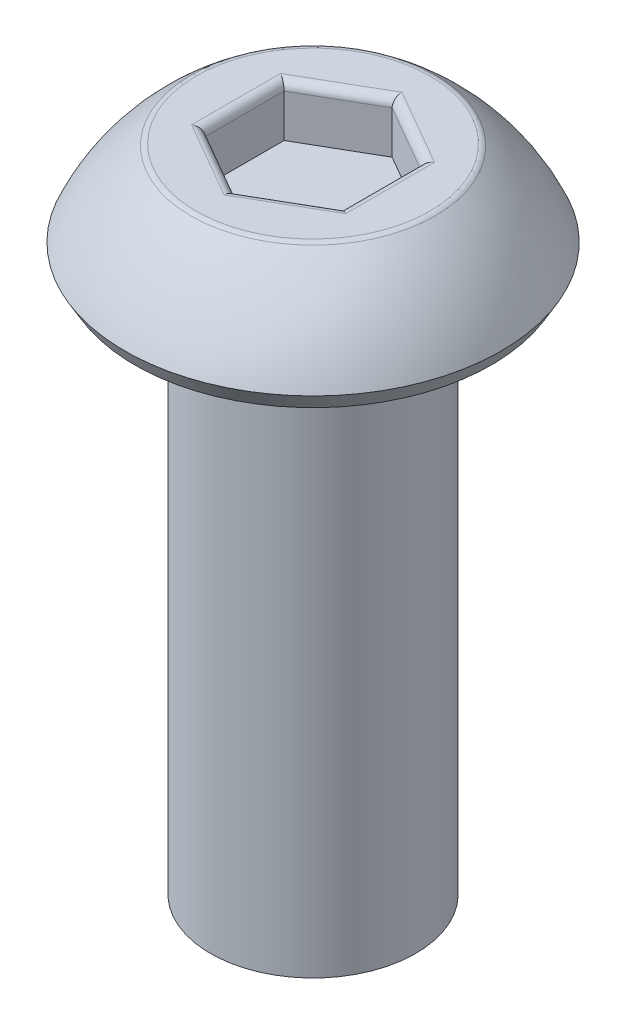
ISO-10303-21;
HEADER;
FILE_DESCRIPTION(('STEP AP214'),'2;1');
FILE_NAME('part.step','',(''),(''),'','','');
FILE_SCHEMA(('AUTOMOTIVE_DESIGN { 1 0 10303 214 1 1 1 1 }'));
ENDSEC;
DATA;
#1=APPLICATION_CONTEXT('core data for automotive mechanical design processes');
#2=APPLICATION_PROTOCOL_DEFINITION('international standard','automotive_design',2000,#1);
#3=PRODUCT_CONTEXT('',#1,'mechanical');
#4=PRODUCT('Part','Part','',(#3));
#5=PRODUCT_RELATED_PRODUCT_CATEGORY('part','',(#4));
#6=PRODUCT_DEFINITION_FORMATION('','',#4);
#7=PRODUCT_DEFINITION_CONTEXT('part definition',#1,'design');
#8=PRODUCT_DEFINITION('design','',#6,#7);
#9=PRODUCT_DEFINITION_SHAPE('','',#8);
#10=(LENGTH_UNIT() NAMED_UNIT(*) SI_UNIT(.MILLI.,.METRE.));
#11=(NAMED_UNIT(*) PLANE_ANGLE_UNIT() SI_UNIT($,.RADIAN.));
#12=(NAMED_UNIT(*) SI_UNIT($,.STERADIAN.) SOLID_ANGLE_UNIT());
#13=UNCERTAINTY_MEASURE_WITH_UNIT(LENGTH_MEASURE(1.E-05),#10,'distance_accuracy_value','');
#14=(GEOMETRIC_REPRESENTATION_CONTEXT(3) GLOBAL_UNCERTAINTY_ASSIGNED_CONTEXT((#13)) GLOBAL_UNIT_ASSIGNED_CONTEXT((#10,
#11,#12)) REPRESENTATION_CONTEXT('',''));
#15=CARTESIAN_POINT('',(0.,0.,0.));
#16=DIRECTION('',(0.,0.,1.));
#17=DIRECTION('',(1.,0.,0.));
#18=AXIS2_PLACEMENT_3D('',#15,#16,#17);
#19=CARTESIAN_POINT('',(0.,1.5,0.));
#20=DIRECTION('',(0.,-1.,0.));
#21=DIRECTION('',(0.,0.,-1.));
#22=AXIS2_PLACEMENT_3D('',#19,#20,#21);
#23=PLANE('',#22);
#24=CARTESIAN_POINT('',(0.,1.5,0.));
#25=DIRECTION('',(0.,-1.,0.));
#26=DIRECTION('',(0.,0.,-1.));
#27=AXIS2_PLACEMENT_3D('',#24,#25,#26);
#28=CIRCLE('',#27,1.70906948191647);
#29=CARTESIAN_POINT('',(0.,1.5,-1.70906948191647));
#30=VERTEX_POINT('',#29);
#31=EDGE_CURVE('E177',#30,#30,#28,.F.);
#32=ORIENTED_EDGE('',*,*,#31,.T.);
#33=EDGE_LOOP('',(#32));
#34=FACE_BOUND('',#33,.T.);
#35=DIRECTION('',(0.866025403784439,0.,-0.5));
#36=VECTOR('',#35,1.);
#37=CARTESIAN_POINT('',(0.5625,1.5,0.974278579257493));
#38=LINE('',#37,#36);
#39=CARTESIAN_POINT('',(1.125,1.5,0.649519052838329));
#40=VERTEX_POINT('',#39);
#41=CARTESIAN_POINT('',(0.,1.5,1.29903810567666));
#42=VERTEX_POINT('',#41);
#43=EDGE_CURVE('E172',#40,#42,#38,.F.);
#44=ORIENTED_EDGE('',*,*,#43,.T.);
#45=DIRECTION('',(0.866025403784439,0.,0.5));
#46=VECTOR('',#45,1.);
#47=CARTESIAN_POINT('',(-0.5625,1.5,0.974278579257493));
#48=LINE('',#47,#46);
#49=CARTESIAN_POINT('',(-1.125,1.5,0.649519052838329));
#50=VERTEX_POINT('',#49);
#51=EDGE_CURVE('E174',#42,#50,#48,.F.);
#52=ORIENTED_EDGE('',*,*,#51,.T.);
#53=DIRECTION('',(0.,0.,1.));
#54=VECTOR('',#53,1.);
#55=CARTESIAN_POINT('',(-1.125,1.5,0.));
#56=LINE('',#55,#54);
#57=CARTESIAN_POINT('',(-1.125,1.5,-0.649519052838329));
#58=VERTEX_POINT('',#57);
#59=EDGE_CURVE('E164',#50,#58,#56,.F.);
#60=ORIENTED_EDGE('',*,*,#59,.T.);
#61=DIRECTION('',(-0.866025403784439,0.,0.5));
#62=VECTOR('',#61,1.);
#63=CARTESIAN_POINT('',(-0.5625,1.5,-0.974278579257493));
#64=LINE('',#63,#62);
#65=CARTESIAN_POINT('',(0.,1.5,-1.29903810567666));
#66=VERTEX_POINT('',#65);
#67=EDGE_CURVE('E166',#58,#66,#64,.F.);
#68=ORIENTED_EDGE('',*,*,#67,.T.);
#69=DIRECTION('',(-0.866025403784439,0.,-0.5));
#70=VECTOR('',#69,1.);
#71=CARTESIAN_POINT('',(0.5625,1.5,-0.974278579257494));
#72=LINE('',#71,#70);
#73=CARTESIAN_POINT('',(1.125,1.5,-0.64951905283833));
#74=VERTEX_POINT('',#73);
#75=EDGE_CURVE('E168',#66,#74,#72,.F.);
#76=ORIENTED_EDGE('',*,*,#75,.T.);
#77=DIRECTION('',(0.,0.,-1.));
#78=VECTOR('',#77,1.);
#79=CARTESIAN_POINT('',(1.125,1.5,0.));
#80=LINE('',#79,#78);
#81=EDGE_CURVE('E170',#74,#40,#80,.F.);
#82=ORIENTED_EDGE('',*,*,#81,.T.);
#83=EDGE_LOOP('',(#44,#52,#60,#68,#76,#82));
#84=FACE_BOUND('',#83,.T.);
#85=ADVANCED_FACE('F35',(#34,#84),#23,.F.);
#86=CARTESIAN_POINT('',(0.,-0.931154789034212,0.));
#87=DIRECTION('',(0.,-1.,0.));
#88=DIRECTION('',(0.,0.,-1.));
#89=AXIS2_PLACEMENT_3D('',#86,#87,#88);
#90=DEGENERATE_TOROIDAL_SURFACE('',#89,0.00769348629276519,3.,.F.);
#91=CARTESIAN_POINT('',(0.,1.47526759952323,0.));
#92=DIRECTION('',(0.,-1.,0.));
#93=DIRECTION('',(0.,0.,-1.));
#94=AXIS2_PLACEMENT_3D('',#91,#92,#93);
#95=CIRCLE('',#94,1.78371135009948);
#96=CARTESIAN_POINT('',(0.,1.47526759952323,-1.78371135009948));
#97=VERTEX_POINT('',#96);
#98=EDGE_CURVE('E161',#97,#97,#95,.T.);
#99=ORIENTED_EDGE('',*,*,#98,.T.);
#100=EDGE_LOOP('',(#99));
#101=FACE_BOUND('',#100,.T.);
#102=CARTESIAN_POINT('',(0.,0.25,0.));
#103=DIRECTION('',(0.,-1.,0.));
#104=DIRECTION('',(0.,0.,-1.));
#105=AXIS2_PLACEMENT_3D('',#102,#103,#104);
#106=CIRCLE('',#105,2.75);
#107=CARTESIAN_POINT('',(0.,0.25,-2.75));
#108=VERTEX_POINT('',#107);
#109=EDGE_CURVE('E158',#108,#108,#106,.T.);
#110=ORIENTED_EDGE('',*,*,#109,.F.);
#111=EDGE_LOOP('',(#110));
#112=FACE_BOUND('',#111,.T.);
#113=ADVANCED_FACE('F244',(#101,#112),#90,.F.);
#114=CARTESIAN_POINT('',(0.,0.25,0.));
#115=DIRECTION('',(0.,1.,0.));
#116=DIRECTION('',(0.,0.,1.));
#117=AXIS2_PLACEMENT_3D('',#114,#115,#116);
#118=CONICAL_SURFACE('',#117,2.75,0.523598775598296);
#119=CARTESIAN_POINT('',(0.,0.,0.));
#120=DIRECTION('',(0.,-1.,0.));
#121=DIRECTION('',(0.,0.,-1.));
#122=AXIS2_PLACEMENT_3D('',#119,#120,#121);
#123=CIRCLE('',#122,2.60566243270259);
#124=CARTESIAN_POINT('',(0.,0.,-2.60566243270259));
#125=VERTEX_POINT('',#124);
#126=EDGE_CURVE('E155',#125,#125,#123,.T.);
#127=ORIENTED_EDGE('',*,*,#126,.F.);
#128=EDGE_LOOP('',(#127));
#129=FACE_BOUND('',#128,.T.);
#130=ORIENTED_EDGE('',*,*,#109,.T.);
#131=EDGE_LOOP('',(#130));
#132=FACE_BOUND('',#131,.T.);
#133=ADVANCED_FACE('F250',(#129,#132),#118,.T.);
#134=CARTESIAN_POINT('',(0.,0.,2.60566243270259));
#135=DIRECTION('',(0.,1.,0.));
#136=DIRECTION('',(0.,0.,1.));
#137=AXIS2_PLACEMENT_3D('',#134,#135,#136);
#138=PLANE('',#137);
#139=CARTESIAN_POINT('',(0.,0.,0.));
#140=DIRECTION('',(0.,-1.,0.));
#141=DIRECTION('',(0.,0.,-1.));
#142=AXIS2_PLACEMENT_3D('',#139,#140,#141);
#143=CIRCLE('',#142,1.5);
#144=CARTESIAN_POINT('',(0.,0.,-1.5));
#145=VERTEX_POINT('',#144);
#146=EDGE_CURVE('E152',#145,#145,#143,.T.);
#147=ORIENTED_EDGE('',*,*,#146,.F.);
#148=EDGE_LOOP('',(#147));
#149=FACE_BOUND('',#148,.T.);
#150=ORIENTED_EDGE('',*,*,#126,.T.);
#151=EDGE_LOOP('',(#150));
#152=FACE_BOUND('',#151,.T.);
#153=ADVANCED_FACE('F269',(#149,#152),#138,.F.);
#154=CARTESIAN_POINT('',(0.,-8.,0.));
#155=DIRECTION('',(0.,-1.,0.));
#156=DIRECTION('',(0.,0.,-1.));
#157=AXIS2_PLACEMENT_3D('',#154,#155,#156);
#158=CYLINDRICAL_SURFACE('',#157,1.5);
#159=CARTESIAN_POINT('',(0.,-8.,0.));
#160=DIRECTION('',(0.,-1.,0.));
#161=DIRECTION('',(0.,0.,-1.));
#162=AXIS2_PLACEMENT_3D('',#159,#160,#161);
#163=CIRCLE('',#162,1.5);
#164=CARTESIAN_POINT('',(0.,-8.,-1.5));
#165=VERTEX_POINT('',#164);
#166=EDGE_CURVE('E139',#165,#165,#163,.T.);
#167=ORIENTED_EDGE('',*,*,#166,.F.);
#168=EDGE_LOOP('',(#167));
#169=FACE_BOUND('',#168,.T.);
#170=ORIENTED_EDGE('',*,*,#146,.T.);
#171=EDGE_LOOP('',(#170));
#172=FACE_BOUND('',#171,.T.);
#173=ADVANCED_FACE('F274',(#169,#172),#158,.T.);
#174=CARTESIAN_POINT('',(0.,-8.,1.5));
#175=DIRECTION('',(0.,1.,0.));
#176=DIRECTION('',(0.,0.,1.));
#177=AXIS2_PLACEMENT_3D('',#174,#175,#176);
#178=PLANE('',#177);
#179=ORIENTED_EDGE('',*,*,#166,.T.);
#180=EDGE_LOOP('',(#179));
#181=FACE_BOUND('',#180,.T.);
#182=ADVANCED_FACE('F281',(#181),#178,.F.);
#183=CARTESIAN_POINT('',(0.999999999999999,0.75,-0.577350269189626));
#184=DIRECTION('',(0.5,0.,-0.866025403784439));
#185=DIRECTION('',(-0.866025403784439,0.,-0.5));
#186=AXIS2_PLACEMENT_3D('',#183,#184,#185);
#187=PLANE('',#186);
#188=DIRECTION('',(0.,1.,0.));
#189=VECTOR('',#188,1.);
#190=CARTESIAN_POINT('',(0.999999999999999,0.75,-0.577350269189626));
#191=LINE('',#190,#189);
#192=CARTESIAN_POINT('',(0.999999999999999,0.75,-0.577350269189626));
#193=VERTEX_POINT('',#192);
#194=CARTESIAN_POINT('',(0.999999999999999,1.375,-0.577350269189626));
#195=VERTEX_POINT('',#194);
#196=EDGE_CURVE('E137',#193,#195,#191,.T.);
#197=ORIENTED_EDGE('',*,*,#196,.T.);
#198=DIRECTION('',(-0.866025403784439,0.,-0.5));
#199=VECTOR('',#198,1.);
#200=CARTESIAN_POINT('',(0.999999999999999,1.375,-0.577350269189626));
#201=LINE('',#200,#199);
#202=CARTESIAN_POINT('',(0.,1.375,-1.15470053837925));
#203=VERTEX_POINT('',#202);
#204=EDGE_CURVE('E59',#195,#203,#201,.T.);
#205=ORIENTED_EDGE('',*,*,#204,.T.);
#206=DIRECTION('',(0.,1.,0.));
#207=VECTOR('',#206,1.);
#208=CARTESIAN_POINT('',(0.,0.75,-1.15470053837925));
#209=LINE('',#208,#207);
#210=CARTESIAN_POINT('',(0.,0.75,-1.15470053837925));
#211=VERTEX_POINT('',#210);
#212=EDGE_CURVE('E105',#211,#203,#209,.T.);
#213=ORIENTED_EDGE('',*,*,#212,.F.);
#214=DIRECTION('',(-0.866025403784439,0.,-0.5));
#215=VECTOR('',#214,1.);
#216=CARTESIAN_POINT('',(0.999999999999999,0.75,-0.577350269189626));
#217=LINE('',#216,#215);
#218=EDGE_CURVE('E109',#193,#211,#217,.T.);
#219=ORIENTED_EDGE('',*,*,#218,.F.);
#220=EDGE_LOOP('',(#197,#205,#213,#219));
#221=FACE_BOUND('',#220,.T.);
#222=ADVANCED_FACE('F107',(#221),#187,.F.);
#223=CARTESIAN_POINT('',(1.,0.75,0.577350269189626));
#224=DIRECTION('',(1.,0.,0.));
#225=DIRECTION('',(0.,0.,-1.));
#226=AXIS2_PLACEMENT_3D('',#223,#224,#225);
#227=PLANE('',#226);
#228=DIRECTION('',(0.,1.,0.));
#229=VECTOR('',#228,1.);
#230=CARTESIAN_POINT('',(1.,0.75,0.577350269189626));
#231=LINE('',#230,#229);
#232=CARTESIAN_POINT('',(1.,0.75,0.577350269189626));
#233=VERTEX_POINT('',#232);
#234=CARTESIAN_POINT('',(1.,1.375,0.577350269189626));
#235=VERTEX_POINT('',#234);
#236=EDGE_CURVE('E140',#233,#235,#231,.T.);
#237=ORIENTED_EDGE('',*,*,#236,.T.);
#238=DIRECTION('',(0.,0.,-1.));
#239=VECTOR('',#238,1.);
#240=CARTESIAN_POINT('',(1.,1.375,0.577350269189626));
#241=LINE('',#240,#239);
#242=EDGE_CURVE('E185',#235,#195,#241,.T.);
#243=ORIENTED_EDGE('',*,*,#242,.T.);
#244=ORIENTED_EDGE('',*,*,#196,.F.);
#245=DIRECTION('',(0.,0.,-1.));
#246=VECTOR('',#245,1.);
#247=CARTESIAN_POINT('',(1.,0.75,0.577350269189626));
#248=LINE('',#247,#246);
#249=EDGE_CURVE('E113',#233,#193,#248,.T.);
#250=ORIENTED_EDGE('',*,*,#249,.F.);
#251=EDGE_LOOP('',(#237,#243,#244,#250));
#252=FACE_BOUND('',#251,.T.);
#253=ADVANCED_FACE('F225',(#252),#227,.F.);
#254=CARTESIAN_POINT('',(0.,0.75,1.15470053837925));
#255=DIRECTION('',(0.5,0.,0.866025403784439));
#256=DIRECTION('',(0.866025403784439,0.,-0.5));
#257=AXIS2_PLACEMENT_3D('',#254,#255,#256);
#258=PLANE('',#257);
#259=DIRECTION('',(0.,1.,0.));
#260=VECTOR('',#259,1.);
#261=CARTESIAN_POINT('',(0.,0.75,1.15470053837925));
#262=LINE('',#261,#260);
#263=CARTESIAN_POINT('',(0.,0.75,1.15470053837925));
#264=VERTEX_POINT('',#263);
#265=CARTESIAN_POINT('',(0.,1.375,1.15470053837925));
#266=VERTEX_POINT('',#265);
#267=EDGE_CURVE('E143',#264,#266,#262,.T.);
#268=ORIENTED_EDGE('',*,*,#267,.T.);
#269=DIRECTION('',(0.866025403784439,0.,-0.5));
#270=VECTOR('',#269,1.);
#271=CARTESIAN_POINT('',(0.,1.375,1.15470053837925));
#272=LINE('',#271,#270);
#273=EDGE_CURVE('E183',#266,#235,#272,.T.);
#274=ORIENTED_EDGE('',*,*,#273,.T.);
#275=ORIENTED_EDGE('',*,*,#236,.F.);
#276=DIRECTION('',(0.866025403784439,0.,-0.5));
#277=VECTOR('',#276,1.);
#278=CARTESIAN_POINT('',(0.,0.75,1.15470053837925));
#279=LINE('',#278,#277);
#280=EDGE_CURVE('E134',#264,#233,#279,.T.);
#281=ORIENTED_EDGE('',*,*,#280,.F.);
#282=EDGE_LOOP('',(#268,#274,#275,#281));
#283=FACE_BOUND('',#282,.T.);
#284=ADVANCED_FACE('F226',(#283),#258,.F.);
#285=CARTESIAN_POINT('',(-0.999999999999999,0.75,0.577350269189626));
#286=DIRECTION('',(-0.5,0.,0.866025403784439));
#287=DIRECTION('',(0.866025403784439,0.,0.5));
#288=AXIS2_PLACEMENT_3D('',#285,#286,#287);
#289=PLANE('',#288);
#290=DIRECTION('',(0.,1.,0.));
#291=VECTOR('',#290,1.);
#292=CARTESIAN_POINT('',(-0.999999999999999,0.75,0.577350269189626));
#293=LINE('',#292,#291);
#294=CARTESIAN_POINT('',(-0.999999999999999,0.75,0.577350269189626));
#295=VERTEX_POINT('',#294);
#296=CARTESIAN_POINT('',(-0.999999999999999,1.375,0.577350269189626));
#297=VERTEX_POINT('',#296);
#298=EDGE_CURVE('E146',#295,#297,#293,.T.);
#299=ORIENTED_EDGE('',*,*,#298,.T.);
#300=DIRECTION('',(0.866025403784439,0.,0.5));
#301=VECTOR('',#300,1.);
#302=CARTESIAN_POINT('',(-0.999999999999999,1.375,0.577350269189626));
#303=LINE('',#302,#301);
#304=EDGE_CURVE('E180',#297,#266,#303,.T.);
#305=ORIENTED_EDGE('',*,*,#304,.T.);
#306=ORIENTED_EDGE('',*,*,#267,.F.);
#307=DIRECTION('',(0.866025403784439,0.,0.5));
#308=VECTOR('',#307,1.);
#309=CARTESIAN_POINT('',(-0.999999999999999,0.75,0.577350269189626));
#310=LINE('',#309,#308);
#311=EDGE_CURVE('E131',#295,#264,#310,.T.);
#312=ORIENTED_EDGE('',*,*,#311,.F.);
#313=EDGE_LOOP('',(#299,#305,#306,#312));
#314=FACE_BOUND('',#313,.T.);
#315=ADVANCED_FACE('F221',(#314),#289,.F.);
#316=CARTESIAN_POINT('',(-1.,0.75,-0.577350269189626));
#317=DIRECTION('',(-1.,0.,0.));
#318=DIRECTION('',(0.,0.,1.));
#319=AXIS2_PLACEMENT_3D('',#316,#317,#318);
#320=PLANE('',#319);
#321=DIRECTION('',(0.,1.,0.));
#322=VECTOR('',#321,1.);
#323=CARTESIAN_POINT('',(-1.,0.75,-0.577350269189626));
#324=LINE('',#323,#322);
#325=CARTESIAN_POINT('',(-1.,0.75,-0.577350269189626));
#326=VERTEX_POINT('',#325);
#327=CARTESIAN_POINT('',(-1.,1.375,-0.577350269189626));
#328=VERTEX_POINT('',#327);
#329=EDGE_CURVE('E112',#326,#328,#324,.T.);
#330=ORIENTED_EDGE('',*,*,#329,.T.);
#331=DIRECTION('',(0.,0.,1.));
#332=VECTOR('',#331,1.);
#333=CARTESIAN_POINT('',(-1.,1.375,-0.577350269189626));
#334=LINE('',#333,#332);
#335=EDGE_CURVE('E11',#328,#297,#334,.T.);
#336=ORIENTED_EDGE('',*,*,#335,.T.);
#337=ORIENTED_EDGE('',*,*,#298,.F.);
#338=DIRECTION('',(0.,0.,1.));
#339=VECTOR('',#338,1.);
#340=CARTESIAN_POINT('',(-1.,0.75,-0.577350269189626));
#341=LINE('',#340,#339);
#342=EDGE_CURVE('E121',#326,#295,#341,.T.);
#343=ORIENTED_EDGE('',*,*,#342,.F.);
#344=EDGE_LOOP('',(#330,#336,#337,#343));
#345=FACE_BOUND('',#344,.T.);
#346=ADVANCED_FACE('F218',(#345),#320,.F.);
#347=CARTESIAN_POINT('',(0.,0.75,-1.15470053837925));
#348=DIRECTION('',(-0.5,0.,-0.866025403784438));
#349=DIRECTION('',(-0.866025403784439,0.,0.5));
#350=AXIS2_PLACEMENT_3D('',#347,#348,#349);
#351=PLANE('',#350);
#352=ORIENTED_EDGE('',*,*,#212,.T.);
#353=DIRECTION('',(-0.866025403784439,0.,0.5));
#354=VECTOR('',#353,1.);
#355=CARTESIAN_POINT('',(0.,1.375,-1.15470053837925));
#356=LINE('',#355,#354);
#357=EDGE_CURVE('E44',#203,#328,#356,.T.);
#358=ORIENTED_EDGE('',*,*,#357,.T.);
#359=ORIENTED_EDGE('',*,*,#329,.F.);
#360=DIRECTION('',(-0.866025403784439,0.,0.5));
#361=VECTOR('',#360,1.);
#362=CARTESIAN_POINT('',(0.,0.75,-1.15470053837925));
#363=LINE('',#362,#361);
#364=EDGE_CURVE('E116',#211,#326,#363,.T.);
#365=ORIENTED_EDGE('',*,*,#364,.F.);
#366=EDGE_LOOP('',(#352,#358,#359,#365));
#367=FACE_BOUND('',#366,.T.);
#368=ADVANCED_FACE('F117',(#367),#351,.F.);
#369=CARTESIAN_POINT('',(0.,0.75,0.));
#370=DIRECTION('',(0.,1.,0.));
#371=DIRECTION('',(0.,0.,1.));
#372=AXIS2_PLACEMENT_3D('',#369,#370,#371);
#373=PLANE('',#372);
#374=ORIENTED_EDGE('',*,*,#218,.T.);
#375=ORIENTED_EDGE('',*,*,#364,.T.);
#376=ORIENTED_EDGE('',*,*,#342,.T.);
#377=ORIENTED_EDGE('',*,*,#311,.T.);
#378=ORIENTED_EDGE('',*,*,#280,.T.);
#379=ORIENTED_EDGE('',*,*,#249,.T.);
#380=EDGE_LOOP('',(#374,#375,#376,#377,#378,#379));
#381=FACE_BOUND('',#380,.T.);
#382=ADVANCED_FACE('F123',(#381),#373,.T.);
#383=CARTESIAN_POINT('',(0.,1.375,0.));
#384=DIRECTION('',(0.,-1.,0.));
#385=DIRECTION('',(0.,0.,-1.));
#386=AXIS2_PLACEMENT_3D('',#383,#384,#385);
#387=TOROIDAL_SURFACE('',#386,1.70906948191647,0.125);
#388=ORIENTED_EDGE('',*,*,#31,.F.);
#389=EDGE_LOOP('',(#388));
#390=FACE_BOUND('',#389,.T.);
#391=ORIENTED_EDGE('',*,*,#98,.F.);
#392=EDGE_LOOP('',(#391));
#393=FACE_BOUND('',#392,.T.);
#394=ADVANCED_FACE('F254',(#390,#393),#387,.T.);
#395=CARTESIAN_POINT('',(1.0625,1.375,-0.685603444662681));
#396=DIRECTION('',(-0.866025403784439,0.,-0.5));
#397=DIRECTION('',(-0.5,0.,0.866025403784439));
#398=AXIS2_PLACEMENT_3D('',#395,#396,#397);
#399=CYLINDRICAL_SURFACE('',#398,0.125);
#400=CARTESIAN_POINT('',(1.125,1.375,-0.64951905283833));
#401=DIRECTION('',(-0.5,0.,-0.866025403784438));
#402=DIRECTION('',(0.866025403784439,0.,-0.5));
#403=AXIS2_PLACEMENT_3D('',#400,#401,#402);
#404=ELLIPSE('',#403,0.144337567297406,0.125);
#405=EDGE_CURVE('E128',#74,#195,#404,.F.);
#406=ORIENTED_EDGE('',*,*,#405,.F.);
#407=ORIENTED_EDGE('',*,*,#75,.F.);
#408=CARTESIAN_POINT('',(0.,1.375,-1.29903810567666));
#409=DIRECTION('',(-1.,0.,0.));
#410=DIRECTION('',(0.,0.,-1.));
#411=AXIS2_PLACEMENT_3D('',#408,#409,#410);
#412=ELLIPSE('',#411,0.144337567297406,0.125);
#413=EDGE_CURVE('E39',#203,#66,#412,.T.);
#414=ORIENTED_EDGE('',*,*,#413,.F.);
#415=ORIENTED_EDGE('',*,*,#204,.F.);
#416=EDGE_LOOP('',(#406,#407,#414,#415));
#417=FACE_BOUND('',#416,.T.);
#418=ADVANCED_FACE('F37',(#417),#399,.T.);
#419=CARTESIAN_POINT('',(-0.0625000000000002,1.375,-1.26295371385231));
#420=DIRECTION('',(-0.866025403784439,0.,0.5));
#421=DIRECTION('',(0.5,0.,0.866025403784439));
#422=AXIS2_PLACEMENT_3D('',#419,#420,#421);
#423=CYLINDRICAL_SURFACE('',#422,0.125);
#424=ORIENTED_EDGE('',*,*,#413,.T.);
#425=ORIENTED_EDGE('',*,*,#67,.F.);
#426=CARTESIAN_POINT('',(-1.125,1.375,-0.649519052838329));
#427=DIRECTION('',(-0.5,0.,0.866025403784439));
#428=DIRECTION('',(-0.866025403784439,0.,-0.5));
#429=AXIS2_PLACEMENT_3D('',#426,#427,#428);
#430=ELLIPSE('',#429,0.144337567297406,0.125);
#431=EDGE_CURVE('E196',#328,#58,#430,.T.);
#432=ORIENTED_EDGE('',*,*,#431,.F.);
#433=ORIENTED_EDGE('',*,*,#357,.F.);
#434=EDGE_LOOP('',(#424,#425,#432,#433));
#435=FACE_BOUND('',#434,.T.);
#436=ADVANCED_FACE('F210',(#435),#423,.T.);
#437=CARTESIAN_POINT('',(1.125,1.375,0.577350269189626));
#438=DIRECTION('',(0.,0.,-1.));
#439=DIRECTION('',(-1.,0.,0.));
#440=AXIS2_PLACEMENT_3D('',#437,#438,#439);
#441=CYLINDRICAL_SURFACE('',#440,0.125);
#442=ORIENTED_EDGE('',*,*,#405,.T.);
#443=ORIENTED_EDGE('',*,*,#242,.F.);
#444=CARTESIAN_POINT('',(1.125,1.375,0.649519052838329));
#445=DIRECTION('',(0.5,0.,-0.866025403784439));
#446=DIRECTION('',(0.866025403784439,0.,0.5));
#447=AXIS2_PLACEMENT_3D('',#444,#445,#446);
#448=ELLIPSE('',#447,0.144337567297406,0.125);
#449=EDGE_CURVE('E193',#40,#235,#448,.F.);
#450=ORIENTED_EDGE('',*,*,#449,.F.);
#451=ORIENTED_EDGE('',*,*,#81,.F.);
#452=EDGE_LOOP('',(#442,#443,#450,#451));
#453=FACE_BOUND('',#452,.T.);
#454=ADVANCED_FACE('F203',(#453),#441,.T.);
#455=CARTESIAN_POINT('',(-1.125,1.375,-0.577350269189626));
#456=DIRECTION('',(0.,0.,1.));
#457=DIRECTION('',(1.,0.,0.));
#458=AXIS2_PLACEMENT_3D('',#455,#456,#457);
#459=CYLINDRICAL_SURFACE('',#458,0.125);
#460=ORIENTED_EDGE('',*,*,#431,.T.);
#461=ORIENTED_EDGE('',*,*,#59,.F.);
#462=CARTESIAN_POINT('',(-1.125,1.375,0.649519052838329));
#463=DIRECTION('',(0.5,0.,0.866025403784438));
#464=DIRECTION('',(0.866025403784439,0.,-0.5));
#465=AXIS2_PLACEMENT_3D('',#462,#463,#464);
#466=ELLIPSE('',#465,0.144337567297406,0.125);
#467=EDGE_CURVE('E191',#297,#50,#466,.T.);
#468=ORIENTED_EDGE('',*,*,#467,.F.);
#469=ORIENTED_EDGE('',*,*,#335,.F.);
#470=EDGE_LOOP('',(#460,#461,#468,#469));
#471=FACE_BOUND('',#470,.T.);
#472=ADVANCED_FACE('F215',(#471),#459,.T.);
#473=CARTESIAN_POINT('',(0.0625000000000004,1.375,1.26295371385231));
#474=DIRECTION('',(0.866025403784439,0.,-0.5));
#475=DIRECTION('',(-0.5,0.,-0.866025403784439));
#476=AXIS2_PLACEMENT_3D('',#473,#474,#475);
#477=CYLINDRICAL_SURFACE('',#476,0.125);
#478=ORIENTED_EDGE('',*,*,#449,.T.);
#479=ORIENTED_EDGE('',*,*,#273,.F.);
#480=CARTESIAN_POINT('',(0.,1.375,1.29903810567666));
#481=DIRECTION('',(1.,0.,0.));
#482=DIRECTION('',(0.,0.,1.));
#483=AXIS2_PLACEMENT_3D('',#480,#481,#482);
#484=ELLIPSE('',#483,0.144337567297406,0.125);
#485=EDGE_CURVE('E189',#42,#266,#484,.F.);
#486=ORIENTED_EDGE('',*,*,#485,.F.);
#487=ORIENTED_EDGE('',*,*,#43,.F.);
#488=EDGE_LOOP('',(#478,#479,#486,#487));
#489=FACE_BOUND('',#488,.T.);
#490=ADVANCED_FACE('F230',(#489),#477,.T.);
#491=CARTESIAN_POINT('',(-1.0625,1.375,0.685603444662681));
#492=DIRECTION('',(0.866025403784439,0.,0.5));
#493=DIRECTION('',(0.5,0.,-0.866025403784439));
#494=AXIS2_PLACEMENT_3D('',#491,#492,#493);
#495=CYLINDRICAL_SURFACE('',#494,0.125);
#496=ORIENTED_EDGE('',*,*,#467,.T.);
#497=ORIENTED_EDGE('',*,*,#51,.F.);
#498=ORIENTED_EDGE('',*,*,#485,.T.);
#499=ORIENTED_EDGE('',*,*,#304,.F.);
#500=EDGE_LOOP('',(#496,#497,#498,#499));
#501=FACE_BOUND('',#500,.T.);
#502=ADVANCED_FACE('F235',(#501),#495,.T.);
#503=CLOSED_SHELL('',(#85,#113,#133,#153,#173,#182,#222,#253,#284,#315,#346,#368,#382,#394,#418,
#436,#454,#472,#490,#502));
#504=MANIFOLD_SOLID_BREP('B2',#503);
#505=ADVANCED_BREP_SHAPE_REPRESENTATION('',(#18,#504),#14);
#506=SHAPE_DEFINITION_REPRESENTATION(#9,#505);
ENDSEC;
END-ISO-10303-21;
